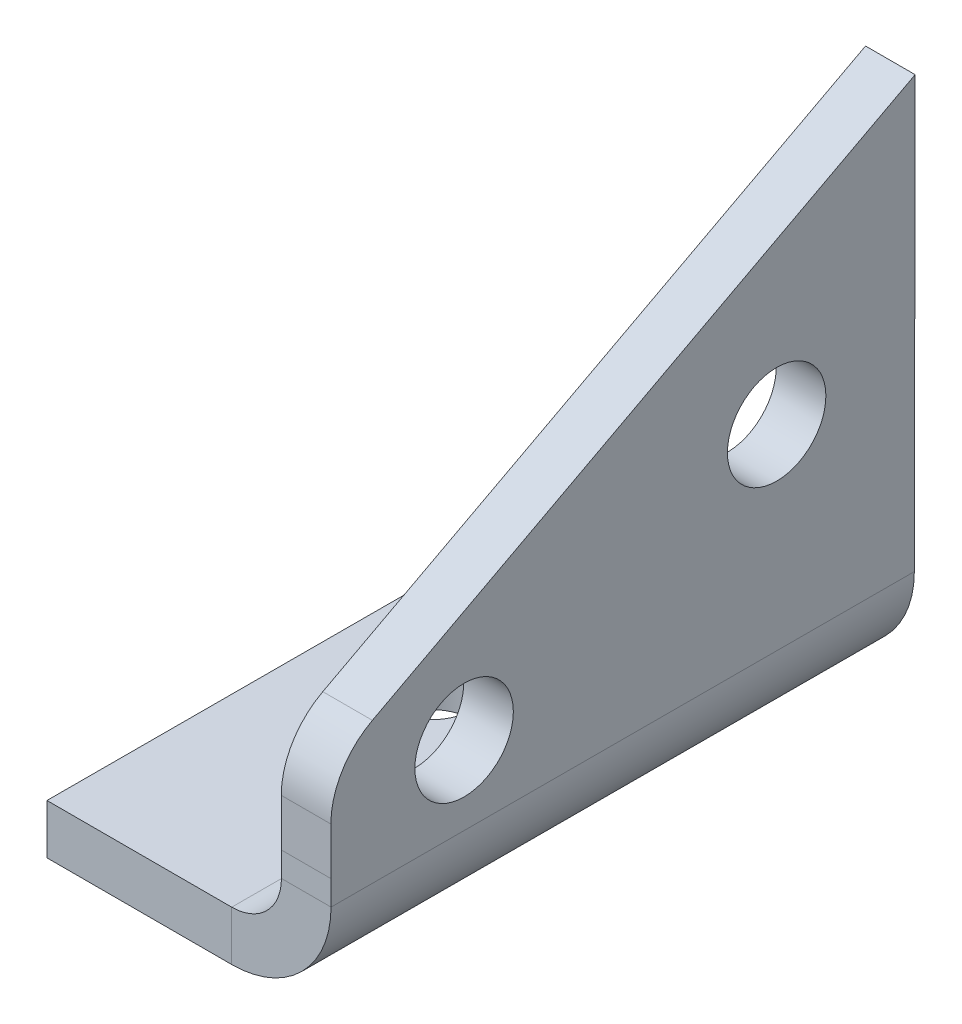
ISO-10303-21;
HEADER;
FILE_DESCRIPTION(('STEP AP214'),'2;1');
FILE_NAME('part.step','',(''),(''),'','','');
FILE_SCHEMA(('AUTOMOTIVE_DESIGN { 1 0 10303 214 1 1 1 1 }'));
ENDSEC;
DATA;
#1=APPLICATION_CONTEXT('core data for automotive mechanical design processes');
#2=APPLICATION_PROTOCOL_DEFINITION('international standard','automotive_design',2000,#1);
#3=PRODUCT_CONTEXT('',#1,'mechanical');
#4=PRODUCT('Part','Part','',(#3));
#5=PRODUCT_RELATED_PRODUCT_CATEGORY('part','',(#4));
#6=PRODUCT_DEFINITION_FORMATION('','',#4);
#7=PRODUCT_DEFINITION_CONTEXT('part definition',#1,'design');
#8=PRODUCT_DEFINITION('design','',#6,#7);
#9=PRODUCT_DEFINITION_SHAPE('','',#8);
#10=(LENGTH_UNIT() NAMED_UNIT(*) SI_UNIT(.MILLI.,.METRE.));
#11=(NAMED_UNIT(*) PLANE_ANGLE_UNIT() SI_UNIT($,.RADIAN.));
#12=(NAMED_UNIT(*) SI_UNIT($,.STERADIAN.) SOLID_ANGLE_UNIT());
#13=UNCERTAINTY_MEASURE_WITH_UNIT(LENGTH_MEASURE(1.E-05),#10,'distance_accuracy_value','');
#14=(GEOMETRIC_REPRESENTATION_CONTEXT(3) GLOBAL_UNCERTAINTY_ASSIGNED_CONTEXT((#13)) GLOBAL_UNIT_ASSIGNED_CONTEXT((#10,
#11,#12)) REPRESENTATION_CONTEXT('',''));
#15=CARTESIAN_POINT('',(0.,0.,0.));
#16=DIRECTION('',(0.,0.,1.));
#17=DIRECTION('',(1.,0.,0.));
#18=AXIS2_PLACEMENT_3D('',#15,#16,#17);
#19=CARTESIAN_POINT('',(-3.175,43.1361689249742,-45.7802099047139));
#20=DIRECTION('',(0.,0.,1.));
#21=DIRECTION('',(1.,0.,0.));
#22=AXIS2_PLACEMENT_3D('',#19,#20,#21);
#23=PLANE('',#22);
#24=DIRECTION('',(0.,-1.,0.));
#25=VECTOR('',#24,1.);
#26=CARTESIAN_POINT('',(-3.175,43.1361689249742,-45.7802099047139));
#27=LINE('',#26,#25);
#28=CARTESIAN_POINT('',(-3.175,43.1361689249742,-45.7802099047139));
#29=VERTEX_POINT('',#28);
#30=CARTESIAN_POINT('',(-3.17500000000001,40.112120038424,-45.7802099047139));
#31=VERTEX_POINT('',#30);
#32=EDGE_CURVE('E232',#29,#31,#27,.T.);
#33=ORIENTED_EDGE('',*,*,#32,.T.);
#34=DIRECTION('',(1.,0.,0.));
#35=VECTOR('',#34,1.);
#36=CARTESIAN_POINT('',(-3.175,40.112120038424,-45.7802099047139));
#37=LINE('',#36,#35);
#38=CARTESIAN_POINT('',(0.,40.112120038424,-45.7802099047139));
#39=VERTEX_POINT('',#38);
#40=EDGE_CURVE('E223',#31,#39,#37,.T.);
#41=ORIENTED_EDGE('',*,*,#40,.T.);
#42=DIRECTION('',(0.,-1.,0.));
#43=VECTOR('',#42,1.);
#44=CARTESIAN_POINT('',(0.,43.1361689249742,-45.7802099047139));
#45=LINE('',#44,#43);
#46=CARTESIAN_POINT('',(0.,43.1361689249742,-45.7802099047139));
#47=VERTEX_POINT('',#46);
#48=EDGE_CURVE('E231',#47,#39,#45,.T.);
#49=ORIENTED_EDGE('',*,*,#48,.F.);
#50=DIRECTION('',(1.,0.,0.));
#51=VECTOR('',#50,1.);
#52=CARTESIAN_POINT('',(-3.175,43.1361689249742,-45.7802099047139));
#53=LINE('',#52,#51);
#54=EDGE_CURVE('E88',#29,#47,#53,.T.);
#55=ORIENTED_EDGE('',*,*,#54,.F.);
#56=EDGE_LOOP('',(#33,#41,#49,#55));
#57=FACE_BOUND('',#56,.T.);
#58=ADVANCED_FACE('F63',(#57),#23,.T.);
#59=CARTESIAN_POINT('',(-3.175,43.1361689249742,-50.7802099047139));
#60=DIRECTION('',(1.,0.,0.));
#61=DIRECTION('',(0.,0.,-1.));
#62=AXIS2_PLACEMENT_3D('',#59,#60,#61);
#63=PLANE('',#62);
#64=CARTESIAN_POINT('',(-3.175,51.0245952416517,-74.3064054804309));
#65=DIRECTION('',(-1.,0.,0.));
#66=DIRECTION('',(0.,0.,1.));
#67=AXIS2_PLACEMENT_3D('',#64,#65,#66);
#68=CIRCLE('',#67,3.15);
#69=CARTESIAN_POINT('',(-3.175,51.0245952416517,-71.1564054804309));
#70=VERTEX_POINT('',#69);
#71=EDGE_CURVE('E258',#70,#70,#68,.T.);
#72=ORIENTED_EDGE('',*,*,#71,.F.);
#73=EDGE_LOOP('',(#72));
#74=FACE_BOUND('',#73,.T.);
#75=CARTESIAN_POINT('',(-3.175,43.5245952416517,-54.3064406141695));
#76=DIRECTION('',(-1.,0.,0.));
#77=DIRECTION('',(0.,0.,1.));
#78=AXIS2_PLACEMENT_3D('',#75,#76,#77);
#79=CIRCLE('',#78,3.15);
#80=CARTESIAN_POINT('',(-3.175,43.5245952416517,-51.1564406141695));
#81=VERTEX_POINT('',#80);
#82=EDGE_CURVE('E264',#81,#81,#79,.T.);
#83=ORIENTED_EDGE('',*,*,#82,.F.);
#84=EDGE_LOOP('',(#83));
#85=FACE_BOUND('',#84,.T.);
#86=DIRECTION('',(0.,-0.00186309094520764,-0.999998264444559));
#87=VECTOR('',#86,1.);
#88=CARTESIAN_POINT('',(-3.17500000000001,40.115050143333,-44.2075009442857));
#89=LINE('',#88,#87);
#90=CARTESIAN_POINT('',(-3.17500000000001,40.1120924864575,-45.7949981890914));
#91=VERTEX_POINT('',#90);
#92=EDGE_CURVE('E221',#31,#91,#89,.T.);
#93=ORIENTED_EDGE('',*,*,#92,.F.);
#94=ORIENTED_EDGE('',*,*,#32,.F.);
#95=CARTESIAN_POINT('',(-3.175,43.1361689249742,-50.7802099047139));
#96=DIRECTION('',(1.,0.,0.));
#97=DIRECTION('',(0.,0.,-1.));
#98=AXIS2_PLACEMENT_3D('',#95,#96,#97);
#99=CIRCLE('',#98,5.);
#100=CARTESIAN_POINT('',(-3.175,47.5535614060292,-48.4378513351692));
#101=VERTEX_POINT('',#100);
#102=EDGE_CURVE('E239',#101,#29,#99,.T.);
#103=ORIENTED_EDGE('',*,*,#102,.F.);
#104=DIRECTION('',(0.,-0.468471713908932,0.883478496210987));
#105=VECTOR('',#104,1.);
#106=CARTESIAN_POINT('',(-3.175,65.9701629409507,-83.1692362754184));
#107=LINE('',#106,#105);
#108=CARTESIAN_POINT('',(-3.175,65.9701629409507,-83.1692362754184));
#109=VERTEX_POINT('',#108);
#110=EDGE_CURVE('E236',#109,#101,#107,.T.);
#111=ORIENTED_EDGE('',*,*,#110,.F.);
#112=DIRECTION('',(0.,0.999998264444559,-0.00186309094520672));
#113=VECTOR('',#112,1.);
#114=CARTESIAN_POINT('',(-3.175,32.1050645348675,-83.1061424077165));
#115=LINE('',#114,#113);
#116=CARTESIAN_POINT('',(-3.17500000000001,38.4550535140904,-83.1179730352186));
#117=VERTEX_POINT('',#116);
#118=EDGE_CURVE('E110',#117,#109,#115,.T.);
#119=ORIENTED_EDGE('',*,*,#118,.F.);
#120=DIRECTION('',(0.,0.0018630909452073,0.999998264444559));
#121=VECTOR('',#120,1.);
#122=CARTESIAN_POINT('',(-3.17500000000001,38.5245952416517,-45.7920405322159));
#123=LINE('',#122,#121);
#124=CARTESIAN_POINT('',(-3.17500000000001,38.5245952416517,-45.7920405322159));
#125=VERTEX_POINT('',#124);
#126=EDGE_CURVE('E211',#125,#117,#123,.F.);
#127=ORIENTED_EDGE('',*,*,#126,.F.);
#128=DIRECTION('',(0.,-0.999998264444559,0.00186309094520764));
#129=VECTOR('',#128,1.);
#130=CARTESIAN_POINT('',(-3.17500000000001,40.1120924864575,-45.7949981890914));
#131=LINE('',#130,#129);
#132=EDGE_CURVE('E224',#91,#125,#131,.T.);
#133=ORIENTED_EDGE('',*,*,#132,.F.);
#134=EDGE_LOOP('',(#93,#94,#103,#111,#119,#127,#133));
#135=FACE_BOUND('',#134,.T.);
#136=ADVANCED_FACE('F300',(#74,#85,#135),#63,.F.);
#137=CARTESIAN_POINT('',(0.,43.1361689249742,-50.7802099047139));
#138=DIRECTION('',(1.,0.,0.));
#139=DIRECTION('',(0.,0.,-1.));
#140=AXIS2_PLACEMENT_3D('',#137,#138,#139);
#141=PLANE('',#140);
#142=CARTESIAN_POINT('',(0.,51.0245952416517,-74.3064054804309));
#143=DIRECTION('',(1.,0.,0.));
#144=DIRECTION('',(0.,0.,-1.));
#145=AXIS2_PLACEMENT_3D('',#142,#143,#144);
#146=CIRCLE('',#145,3.15);
#147=CARTESIAN_POINT('',(0.,51.0245952416517,-77.4564054804309));
#148=VERTEX_POINT('',#147);
#149=EDGE_CURVE('E66',#148,#148,#146,.T.);
#150=ORIENTED_EDGE('',*,*,#149,.F.);
#151=EDGE_LOOP('',(#150));
#152=FACE_BOUND('',#151,.T.);
#153=CARTESIAN_POINT('',(0.,43.5245952416517,-54.3064406141695));
#154=DIRECTION('',(1.,0.,0.));
#155=DIRECTION('',(0.,0.,-1.));
#156=AXIS2_PLACEMENT_3D('',#153,#154,#155);
#157=CIRCLE('',#156,3.15);
#158=CARTESIAN_POINT('',(0.,43.5245952416517,-57.4564406141695));
#159=VERTEX_POINT('',#158);
#160=EDGE_CURVE('E256',#159,#159,#157,.T.);
#161=ORIENTED_EDGE('',*,*,#160,.F.);
#162=EDGE_LOOP('',(#161));
#163=FACE_BOUND('',#162,.T.);
#164=ORIENTED_EDGE('',*,*,#48,.T.);
#165=DIRECTION('',(0.,-0.00186309094520764,-0.999998264444559));
#166=VECTOR('',#165,1.);
#167=CARTESIAN_POINT('',(0.,40.1028150966653,-50.7745584808544));
#168=LINE('',#167,#166);
#169=CARTESIAN_POINT('',(0.,40.1120924864575,-45.7949981890914));
#170=VERTEX_POINT('',#169);
#171=EDGE_CURVE('E13',#39,#170,#168,.T.);
#172=ORIENTED_EDGE('',*,*,#171,.T.);
#173=DIRECTION('',(0.,-0.999998264444559,0.00186309094520764));
#174=VECTOR('',#173,1.);
#175=CARTESIAN_POINT('',(0.,43.1454463147664,-45.8006496129509));
#176=LINE('',#175,#174);
#177=CARTESIAN_POINT('',(0.,38.5245952416517,-45.7920405322159));
#178=VERTEX_POINT('',#177);
#179=EDGE_CURVE('E71',#170,#178,#176,.T.);
#180=ORIENTED_EDGE('',*,*,#179,.T.);
#181=DIRECTION('',(0.,0.0018630909452073,0.999998264444559));
#182=VECTOR('',#181,1.);
#183=CARTESIAN_POINT('',(0.,38.5245952416517,-45.7920405322159));
#184=LINE('',#183,#182);
#185=CARTESIAN_POINT('',(0.,38.4550535140904,-83.1179730352186));
#186=VERTEX_POINT('',#185);
#187=EDGE_CURVE('E200',#178,#186,#184,.F.);
#188=ORIENTED_EDGE('',*,*,#187,.T.);
#189=DIRECTION('',(0.,0.999998264444559,-0.00186309094520672));
#190=VECTOR('',#189,1.);
#191=CARTESIAN_POINT('',(0.,32.1050645348675,-83.1061424077165));
#192=LINE('',#191,#190);
#193=CARTESIAN_POINT('',(0.,65.9701629409507,-83.1692362754184));
#194=VERTEX_POINT('',#193);
#195=EDGE_CURVE('E244',#186,#194,#192,.T.);
#196=ORIENTED_EDGE('',*,*,#195,.T.);
#197=DIRECTION('',(0.,-0.468471713908932,0.883478496210987));
#198=VECTOR('',#197,1.);
#199=CARTESIAN_POINT('',(0.,65.9701629409507,-83.1692362754184));
#200=LINE('',#199,#198);
#201=CARTESIAN_POINT('',(0.,47.5535614060292,-48.4378513351692));
#202=VERTEX_POINT('',#201);
#203=EDGE_CURVE('E246',#194,#202,#200,.T.);
#204=ORIENTED_EDGE('',*,*,#203,.T.);
#205=CARTESIAN_POINT('',(0.,43.1361689249742,-50.7802099047139));
#206=DIRECTION('',(1.,0.,0.));
#207=DIRECTION('',(0.,0.,-1.));
#208=AXIS2_PLACEMENT_3D('',#205,#206,#207);
#209=CIRCLE('',#208,5.);
#210=EDGE_CURVE('E234',#202,#47,#209,.T.);
#211=ORIENTED_EDGE('',*,*,#210,.T.);
#212=EDGE_LOOP('',(#164,#172,#180,#188,#196,#204,#211));
#213=FACE_BOUND('',#212,.T.);
#214=ADVANCED_FACE('F293',(#152,#163,#213),#141,.T.);
#215=CARTESIAN_POINT('',(-3.175,43.1361689249742,-50.7802099047139));
#216=DIRECTION('',(1.,0.,0.));
#217=DIRECTION('',(0.,0.,-1.));
#218=AXIS2_PLACEMENT_3D('',#215,#216,#217);
#219=CYLINDRICAL_SURFACE('',#218,5.);
#220=ORIENTED_EDGE('',*,*,#210,.F.);
#221=DIRECTION('',(1.,0.,0.));
#222=VECTOR('',#221,1.);
#223=CARTESIAN_POINT('',(-3.175,47.5535614060292,-48.4378513351692));
#224=LINE('',#223,#222);
#225=EDGE_CURVE('E252',#101,#202,#224,.T.);
#226=ORIENTED_EDGE('',*,*,#225,.F.);
#227=ORIENTED_EDGE('',*,*,#102,.T.);
#228=ORIENTED_EDGE('',*,*,#54,.T.);
#229=EDGE_LOOP('',(#220,#226,#227,#228));
#230=FACE_BOUND('',#229,.T.);
#231=ADVANCED_FACE('F302',(#230),#219,.T.);
#232=CARTESIAN_POINT('',(-3.175,65.9701629409507,-83.1692362754184));
#233=DIRECTION('',(0.,0.883478496210987,0.468471713908932));
#234=DIRECTION('',(0.,-0.468471713908932,0.883478496210988));
#235=AXIS2_PLACEMENT_3D('',#232,#233,#234);
#236=PLANE('',#235);
#237=ORIENTED_EDGE('',*,*,#203,.F.);
#238=DIRECTION('',(1.,0.,0.));
#239=VECTOR('',#238,1.);
#240=CARTESIAN_POINT('',(-3.175,65.9701629409507,-83.1692362754184));
#241=LINE('',#240,#239);
#242=EDGE_CURVE('E241',#109,#194,#241,.T.);
#243=ORIENTED_EDGE('',*,*,#242,.F.);
#244=ORIENTED_EDGE('',*,*,#110,.T.);
#245=ORIENTED_EDGE('',*,*,#225,.T.);
#246=EDGE_LOOP('',(#237,#243,#244,#245));
#247=FACE_BOUND('',#246,.T.);
#248=ADVANCED_FACE('F305',(#247),#236,.T.);
#249=CARTESIAN_POINT('',(-3.175,32.1050645348675,-83.1061424077165));
#250=DIRECTION('',(0.,-0.00186309094520672,-0.999998264444559));
#251=DIRECTION('',(0.,0.999998264444559,-0.00186309094520672));
#252=AXIS2_PLACEMENT_3D('',#249,#250,#251);
#253=PLANE('',#252);
#254=DIRECTION('',(1.,0.,0.));
#255=VECTOR('',#254,1.);
#256=CARTESIAN_POINT('',(-3.17500000000001,38.4550535140904,-83.1179730352186));
#257=LINE('',#256,#255);
#258=EDGE_CURVE('E216',#117,#186,#257,.T.);
#259=ORIENTED_EDGE('',*,*,#258,.F.);
#260=ORIENTED_EDGE('',*,*,#118,.T.);
#261=ORIENTED_EDGE('',*,*,#242,.T.);
#262=ORIENTED_EDGE('',*,*,#195,.F.);
#263=EDGE_LOOP('',(#259,#260,#261,#262));
#264=FACE_BOUND('',#263,.T.);
#265=ADVANCED_FACE('F308',(#264),#253,.T.);
#266=CARTESIAN_POINT('',(-3.17500000000001,40.115050143333,-44.2075009442857));
#267=DIRECTION('',(0.,-0.999998264444559,0.00186309094520764));
#268=DIRECTION('',(0.,-0.00186309094520764,-0.999998264444559));
#269=AXIS2_PLACEMENT_3D('',#266,#267,#268);
#270=PLANE('',#269);
#271=ORIENTED_EDGE('',*,*,#40,.F.);
#272=ORIENTED_EDGE('',*,*,#92,.T.);
#273=DIRECTION('',(1.,0.,0.));
#274=VECTOR('',#273,1.);
#275=CARTESIAN_POINT('',(-3.17500000000001,40.1120924864575,-45.7949981890914));
#276=LINE('',#275,#274);
#277=EDGE_CURVE('E218',#91,#170,#276,.T.);
#278=ORIENTED_EDGE('',*,*,#277,.T.);
#279=ORIENTED_EDGE('',*,*,#171,.F.);
#280=EDGE_LOOP('',(#271,#272,#278,#279));
#281=FACE_BOUND('',#280,.T.);
#282=ADVANCED_FACE('F296',(#281),#270,.T.);
#283=CARTESIAN_POINT('',(-3.17500000000001,40.1120924864575,-45.7949981890914));
#284=DIRECTION('',(0.,0.00186309094520764,0.999998264444559));
#285=DIRECTION('',(0.,-0.999998264444559,0.00186309094520764));
#286=AXIS2_PLACEMENT_3D('',#283,#284,#285);
#287=PLANE('',#286);
#288=ORIENTED_EDGE('',*,*,#179,.F.);
#289=ORIENTED_EDGE('',*,*,#277,.F.);
#290=ORIENTED_EDGE('',*,*,#132,.T.);
#291=DIRECTION('',(1.,0.,0.));
#292=VECTOR('',#291,1.);
#293=CARTESIAN_POINT('',(-3.17500000000001,38.5245952416517,-45.7920405322159));
#294=LINE('',#293,#292);
#295=EDGE_CURVE('E205',#125,#178,#294,.T.);
#296=ORIENTED_EDGE('',*,*,#295,.T.);
#297=EDGE_LOOP('',(#288,#289,#290,#296));
#298=FACE_BOUND('',#297,.T.);
#299=ADVANCED_FACE('F288',(#298),#287,.T.);
#300=CARTESIAN_POINT('',(-6.35,38.4550535140904,-83.1179730352186));
#301=DIRECTION('',(0.,-0.0018630909452073,-0.999998264444559));
#302=DIRECTION('',(0.,0.999998264444559,-0.0018630909452073));
#303=AXIS2_PLACEMENT_3D('',#300,#301,#302);
#304=PLANE('',#303);
#305=DIRECTION('',(0.,0.999998264444559,-0.0018630909452066));
#306=VECTOR('',#305,1.);
#307=CARTESIAN_POINT('',(-6.34999999999998,32.1050645348675,-83.1061424077165));
#308=LINE('',#307,#306);
#309=CARTESIAN_POINT('',(-6.34999999999999,35.280059024479,-83.1120577214676));
#310=VERTEX_POINT('',#309);
#311=CARTESIAN_POINT('',(-6.34999999999998,32.1050645348675,-83.1061424077165));
#312=VERTEX_POINT('',#311);
#313=EDGE_CURVE('E181',#310,#312,#308,.F.);
#314=ORIENTED_EDGE('',*,*,#313,.F.);
#315=CARTESIAN_POINT('',(-6.35,38.4550535140904,-83.1179730352186));
#316=DIRECTION('',(0.,0.0018630909452073,0.999998264444559));
#317=DIRECTION('',(0.,-0.999998264444559,0.0018630909452073));
#318=AXIS2_PLACEMENT_3D('',#315,#316,#317);
#319=CIRCLE('',#318,3.175);
#320=EDGE_CURVE('E208',#117,#310,#319,.F.);
#321=ORIENTED_EDGE('',*,*,#320,.F.);
#322=ORIENTED_EDGE('',*,*,#258,.T.);
#323=CARTESIAN_POINT('',(-6.35,38.4550535140904,-83.1179730352186));
#324=DIRECTION('',(0.,0.0018630909452073,0.999998264444559));
#325=DIRECTION('',(0.,-0.999998264444559,0.0018630909452073));
#326=AXIS2_PLACEMENT_3D('',#323,#324,#325);
#327=CIRCLE('',#326,6.35);
#328=EDGE_CURVE('E79',#186,#312,#327,.F.);
#329=ORIENTED_EDGE('',*,*,#328,.T.);
#330=EDGE_LOOP('',(#314,#321,#322,#329));
#331=FACE_BOUND('',#330,.T.);
#332=ADVANCED_FACE('F307',(#331),#304,.T.);
#333=CARTESIAN_POINT('',(-6.35,38.5245952416517,-45.7920405322159));
#334=DIRECTION('',(0.,-0.0018630909452073,-0.999998264444559));
#335=DIRECTION('',(0.,0.999998264444559,-0.0018630909452073));
#336=AXIS2_PLACEMENT_3D('',#333,#334,#335);
#337=PLANE('',#336);
#338=CARTESIAN_POINT('',(-6.35,38.5245952416517,-45.7920405322159));
#339=DIRECTION('',(0.,0.0018630909452073,0.999998264444559));
#340=DIRECTION('',(0.,-0.999998264444559,0.0018630909452073));
#341=AXIS2_PLACEMENT_3D('',#338,#339,#340);
#342=CIRCLE('',#341,3.175);
#343=CARTESIAN_POINT('',(-6.34999999999999,35.3496007520403,-45.7861252184649));
#344=VERTEX_POINT('',#343);
#345=EDGE_CURVE('E213',#344,#125,#342,.T.);
#346=ORIENTED_EDGE('',*,*,#345,.F.);
#347=DIRECTION('',(0.,0.999998264444559,-0.0018630909452066));
#348=VECTOR('',#347,1.);
#349=CARTESIAN_POINT('',(-6.34999999999999,35.3496007520402,-45.7861252184649));
#350=LINE('',#349,#348);
#351=CARTESIAN_POINT('',(-6.34999999999998,32.1746062624288,-45.7802099047139));
#352=VERTEX_POINT('',#351);
#353=EDGE_CURVE('E193',#344,#352,#350,.F.);
#354=ORIENTED_EDGE('',*,*,#353,.T.);
#355=CARTESIAN_POINT('',(-6.35,38.5245952416517,-45.7920405322159));
#356=DIRECTION('',(0.,0.0018630909452073,0.999998264444559));
#357=DIRECTION('',(0.,-0.999998264444559,0.0018630909452073));
#358=AXIS2_PLACEMENT_3D('',#355,#356,#357);
#359=CIRCLE('',#358,6.35);
#360=EDGE_CURVE('E203',#352,#178,#359,.T.);
#361=ORIENTED_EDGE('',*,*,#360,.T.);
#362=ORIENTED_EDGE('',*,*,#295,.F.);
#363=EDGE_LOOP('',(#346,#354,#361,#362));
#364=FACE_BOUND('',#363,.T.);
#365=ADVANCED_FACE('F286',(#364),#337,.F.);
#366=CARTESIAN_POINT('',(-6.35,38.5245952416517,-45.7920405322159));
#367=DIRECTION('',(0.,0.0018630909452073,0.999998264444559));
#368=DIRECTION('',(0.,-0.999998264444559,0.0018630909452073));
#369=AXIS2_PLACEMENT_3D('',#366,#367,#368);
#370=CYLINDRICAL_SURFACE('',#369,6.35);
#371=ORIENTED_EDGE('',*,*,#187,.F.);
#372=ORIENTED_EDGE('',*,*,#360,.F.);
#373=DIRECTION('',(0.,0.0018630909452066,0.999998264444559));
#374=VECTOR('',#373,1.);
#375=CARTESIAN_POINT('',(-6.34999999999998,32.1050645348675,-83.1061424077165));
#376=LINE('',#375,#374);
#377=EDGE_CURVE('E191',#352,#312,#376,.F.);
#378=ORIENTED_EDGE('',*,*,#377,.T.);
#379=ORIENTED_EDGE('',*,*,#328,.F.);
#380=EDGE_LOOP('',(#371,#372,#378,#379));
#381=FACE_BOUND('',#380,.T.);
#382=ADVANCED_FACE('F395',(#381),#370,.T.);
#383=CARTESIAN_POINT('',(-6.35,38.5245952416517,-45.7920405322159));
#384=DIRECTION('',(0.,0.0018630909452073,0.999998264444559));
#385=DIRECTION('',(0.,-0.999998264444559,0.0018630909452073));
#386=AXIS2_PLACEMENT_3D('',#383,#384,#385);
#387=CYLINDRICAL_SURFACE('',#386,3.175);
#388=ORIENTED_EDGE('',*,*,#126,.T.);
#389=ORIENTED_EDGE('',*,*,#320,.T.);
#390=DIRECTION('',(0.,0.0018630909452066,0.999998264444559));
#391=VECTOR('',#390,1.);
#392=CARTESIAN_POINT('',(-6.34999999999999,35.280059024479,-83.1120577214676));
#393=LINE('',#392,#391);
#394=EDGE_CURVE('E196',#310,#344,#393,.T.);
#395=ORIENTED_EDGE('',*,*,#394,.T.);
#396=ORIENTED_EDGE('',*,*,#345,.T.);
#397=EDGE_LOOP('',(#388,#389,#395,#396));
#398=FACE_BOUND('',#397,.T.);
#399=ADVANCED_FACE('F283',(#398),#387,.F.);
#400=CARTESIAN_POINT('',(-18.175,32.1746062624287,-45.7802099047138));
#401=DIRECTION('',(0.,-0.0018630909452066,-0.999998264444559));
#402=DIRECTION('',(0.,0.999998264444559,-0.0018630909452066));
#403=AXIS2_PLACEMENT_3D('',#400,#401,#402);
#404=PLANE('',#403);
#405=ORIENTED_EDGE('',*,*,#353,.F.);
#406=DIRECTION('',(1.,0.,0.));
#407=VECTOR('',#406,1.);
#408=CARTESIAN_POINT('',(-18.175,35.3496007520402,-45.7861252184649));
#409=LINE('',#408,#407);
#410=CARTESIAN_POINT('',(-18.175,35.3496007520402,-45.7861252184649));
#411=VERTEX_POINT('',#410);
#412=EDGE_CURVE('E189',#344,#411,#409,.F.);
#413=ORIENTED_EDGE('',*,*,#412,.T.);
#414=DIRECTION('',(0.,0.999998264444559,-0.0018630909452066));
#415=VECTOR('',#414,1.);
#416=CARTESIAN_POINT('',(-18.175,32.1746062624287,-45.7802099047138));
#417=LINE('',#416,#415);
#418=CARTESIAN_POINT('',(-18.175,32.1746062624287,-45.7802099047139));
#419=VERTEX_POINT('',#418);
#420=EDGE_CURVE('E177',#419,#411,#417,.T.);
#421=ORIENTED_EDGE('',*,*,#420,.F.);
#422=DIRECTION('',(-1.,0.,0.));
#423=VECTOR('',#422,1.);
#424=CARTESIAN_POINT('',(-1.35455966325153E-13,32.1746062624288,-45.7802099047139));
#425=LINE('',#424,#423);
#426=EDGE_CURVE('E164',#352,#419,#425,.T.);
#427=ORIENTED_EDGE('',*,*,#426,.F.);
#428=EDGE_LOOP('',(#405,#413,#421,#427));
#429=FACE_BOUND('',#428,.T.);
#430=ADVANCED_FACE('F276',(#429),#404,.F.);
#431=CARTESIAN_POINT('',(-3.17499999999999,32.1050645348675,-83.1061424077165));
#432=DIRECTION('',(0.,0.0018630909452066,0.999998264444559));
#433=DIRECTION('',(0.,-0.999998264444559,0.0018630909452066));
#434=AXIS2_PLACEMENT_3D('',#431,#432,#433);
#435=PLANE('',#434);
#436=ORIENTED_EDGE('',*,*,#313,.T.);
#437=DIRECTION('',(1.,0.,0.));
#438=VECTOR('',#437,1.);
#439=CARTESIAN_POINT('',(0.,32.1050645348675,-83.1061424077165));
#440=LINE('',#439,#438);
#441=CARTESIAN_POINT('',(-18.175,32.1050645348675,-83.1061424077165));
#442=VERTEX_POINT('',#441);
#443=EDGE_CURVE('E162',#442,#312,#440,.T.);
#444=ORIENTED_EDGE('',*,*,#443,.F.);
#445=DIRECTION('',(0.,0.999998264444559,-0.0018630909452066));
#446=VECTOR('',#445,1.);
#447=CARTESIAN_POINT('',(-18.175,32.1050645348675,-83.1061424077165));
#448=LINE('',#447,#446);
#449=CARTESIAN_POINT('',(-18.175,35.2800590244789,-83.1120577214676));
#450=VERTEX_POINT('',#449);
#451=EDGE_CURVE('E170',#442,#450,#448,.T.);
#452=ORIENTED_EDGE('',*,*,#451,.T.);
#453=DIRECTION('',(-1.,0.,0.));
#454=VECTOR('',#453,1.);
#455=CARTESIAN_POINT('',(-3.175,35.280059024479,-83.1120577214676));
#456=LINE('',#455,#454);
#457=EDGE_CURVE('E186',#450,#310,#456,.F.);
#458=ORIENTED_EDGE('',*,*,#457,.T.);
#459=EDGE_LOOP('',(#436,#444,#452,#458));
#460=FACE_BOUND('',#459,.T.);
#461=ADVANCED_FACE('F180',(#460),#435,.F.);
#462=CARTESIAN_POINT('',(0.,32.2597871274127,-0.0601030216035012));
#463=DIRECTION('',(0.,0.999998264444559,-0.0018630909452066));
#464=DIRECTION('',(0.,0.0018630909452066,0.999998264444559));
#465=AXIS2_PLACEMENT_3D('',#462,#463,#464);
#466=PLANE('',#465);
#467=CARTESIAN_POINT('',(-12.2625,32.1398231079043,-64.4497731087377));
#468=DIRECTION('',(0.,0.999998264444559,-0.0018630909452066));
#469=DIRECTION('',(0.,0.0018630909452066,0.999998264444559));
#470=AXIS2_PLACEMENT_3D('',#467,#468,#469);
#471=CIRCLE('',#470,2.65);
#472=CARTESIAN_POINT('',(-12.2625,32.1447602989091,-61.7997777079596));
#473=VERTEX_POINT('',#472);
#474=EDGE_CURVE('E199',#473,#473,#471,.T.);
#475=ORIENTED_EDGE('',*,*,#474,.T.);
#476=EDGE_LOOP('',(#475));
#477=FACE_BOUND('',#476,.T.);
#478=ORIENTED_EDGE('',*,*,#377,.F.);
#479=ORIENTED_EDGE('',*,*,#426,.T.);
#480=DIRECTION('',(0.,-0.0018630909452066,-0.999998264444559));
#481=VECTOR('',#480,1.);
#482=CARTESIAN_POINT('',(-18.175,32.2597871274126,-0.0601030216035011));
#483=LINE('',#482,#481);
#484=EDGE_CURVE('E157',#419,#442,#483,.T.);
#485=ORIENTED_EDGE('',*,*,#484,.T.);
#486=ORIENTED_EDGE('',*,*,#443,.T.);
#487=EDGE_LOOP('',(#478,#479,#485,#486));
#488=FACE_BOUND('',#487,.T.);
#489=ADVANCED_FACE('F160',(#477,#488),#466,.F.);
#490=CARTESIAN_POINT('',(-1.04517651910578E-13,35.4347816170242,-0.0660183353545321));
#491=DIRECTION('',(0.,0.999998264444559,-0.0018630909452066));
#492=DIRECTION('',(0.,0.0018630909452066,0.999998264444559));
#493=AXIS2_PLACEMENT_3D('',#490,#491,#492);
#494=PLANE('',#493);
#495=CARTESIAN_POINT('',(-12.2625,35.3148175975157,-64.4556884224887));
#496=DIRECTION('',(0.,0.999998264444559,-0.0018630909452066));
#497=DIRECTION('',(0.,0.0018630909452066,0.999998264444559));
#498=AXIS2_PLACEMENT_3D('',#495,#496,#497);
#499=CIRCLE('',#498,2.65);
#500=CARTESIAN_POINT('',(-12.2625,35.3197547885205,-61.8056930217106));
#501=VERTEX_POINT('',#500);
#502=EDGE_CURVE('E262',#501,#501,#499,.T.);
#503=ORIENTED_EDGE('',*,*,#502,.F.);
#504=EDGE_LOOP('',(#503));
#505=FACE_BOUND('',#504,.T.);
#506=ORIENTED_EDGE('',*,*,#412,.F.);
#507=ORIENTED_EDGE('',*,*,#394,.F.);
#508=ORIENTED_EDGE('',*,*,#457,.F.);
#509=DIRECTION('',(0.,0.0018630909452066,0.999998264444559));
#510=VECTOR('',#509,1.);
#511=CARTESIAN_POINT('',(-18.175,35.2800590244789,-83.1120577214676));
#512=LINE('',#511,#510);
#513=EDGE_CURVE('E173',#411,#450,#512,.F.);
#514=ORIENTED_EDGE('',*,*,#513,.F.);
#515=EDGE_LOOP('',(#506,#507,#508,#514));
#516=FACE_BOUND('',#515,.T.);
#517=ADVANCED_FACE('F280',(#505,#516),#494,.T.);
#518=CARTESIAN_POINT('',(-18.175,32.1050645348675,-83.1061424077165));
#519=DIRECTION('',(1.,0.,0.));
#520=DIRECTION('',(0.,1.,0.));
#521=AXIS2_PLACEMENT_3D('',#518,#519,#520);
#522=PLANE('',#521);
#523=ORIENTED_EDGE('',*,*,#513,.T.);
#524=ORIENTED_EDGE('',*,*,#451,.F.);
#525=ORIENTED_EDGE('',*,*,#484,.F.);
#526=ORIENTED_EDGE('',*,*,#420,.T.);
#527=EDGE_LOOP('',(#523,#524,#525,#526));
#528=FACE_BOUND('',#527,.T.);
#529=ADVANCED_FACE('F171',(#528),#522,.F.);
#530=CARTESIAN_POINT('',(-12.2625,25.3148349530702,-64.4370575130366));
#531=DIRECTION('',(0.,0.999998264444559,-0.0018630909452066));
#532=DIRECTION('',(0.,0.0018630909452066,0.999998264444559));
#533=AXIS2_PLACEMENT_3D('',#530,#531,#532);
#534=CYLINDRICAL_SURFACE('',#533,2.65);
#535=ORIENTED_EDGE('',*,*,#502,.T.);
#536=EDGE_LOOP('',(#535));
#537=FACE_BOUND('',#536,.T.);
#538=ORIENTED_EDGE('',*,*,#474,.F.);
#539=EDGE_LOOP('',(#538));
#540=FACE_BOUND('',#539,.T.);
#541=ADVANCED_FACE('F461',(#537,#540),#534,.F.);
#542=CARTESIAN_POINT('',(6.825,43.5245952416517,-54.3064406141695));
#543=DIRECTION('',(-1.,0.,0.));
#544=DIRECTION('',(0.,0.,1.));
#545=AXIS2_PLACEMENT_3D('',#542,#543,#544);
#546=CYLINDRICAL_SURFACE('',#545,3.15);
#547=ORIENTED_EDGE('',*,*,#160,.T.);
#548=EDGE_LOOP('',(#547));
#549=FACE_BOUND('',#548,.T.);
#550=ORIENTED_EDGE('',*,*,#82,.T.);
#551=EDGE_LOOP('',(#550));
#552=FACE_BOUND('',#551,.T.);
#553=ADVANCED_FACE('F470',(#549,#552),#546,.F.);
#554=CARTESIAN_POINT('',(6.825,51.0245952416517,-74.3064054804309));
#555=DIRECTION('',(-1.,0.,0.));
#556=DIRECTION('',(0.,0.,1.));
#557=AXIS2_PLACEMENT_3D('',#554,#555,#556);
#558=CYLINDRICAL_SURFACE('',#557,3.15);
#559=ORIENTED_EDGE('',*,*,#149,.T.);
#560=EDGE_LOOP('',(#559));
#561=FACE_BOUND('',#560,.T.);
#562=ORIENTED_EDGE('',*,*,#71,.T.);
#563=EDGE_LOOP('',(#562));
#564=FACE_BOUND('',#563,.T.);
#565=ADVANCED_FACE('F481',(#561,#564),#558,.F.);
#566=CLOSED_SHELL('',(#58,#136,#214,#231,#248,#265,#282,#299,#332,#365,#382,#399,#430,#461,#489,
#517,#529,#541,#553,#565));
#567=MANIFOLD_SOLID_BREP('B2',#566);
#568=ADVANCED_BREP_SHAPE_REPRESENTATION('',(#18,#567),#14);
#569=SHAPE_DEFINITION_REPRESENTATION(#9,#568);
ENDSEC;
END-ISO-10303-21;
